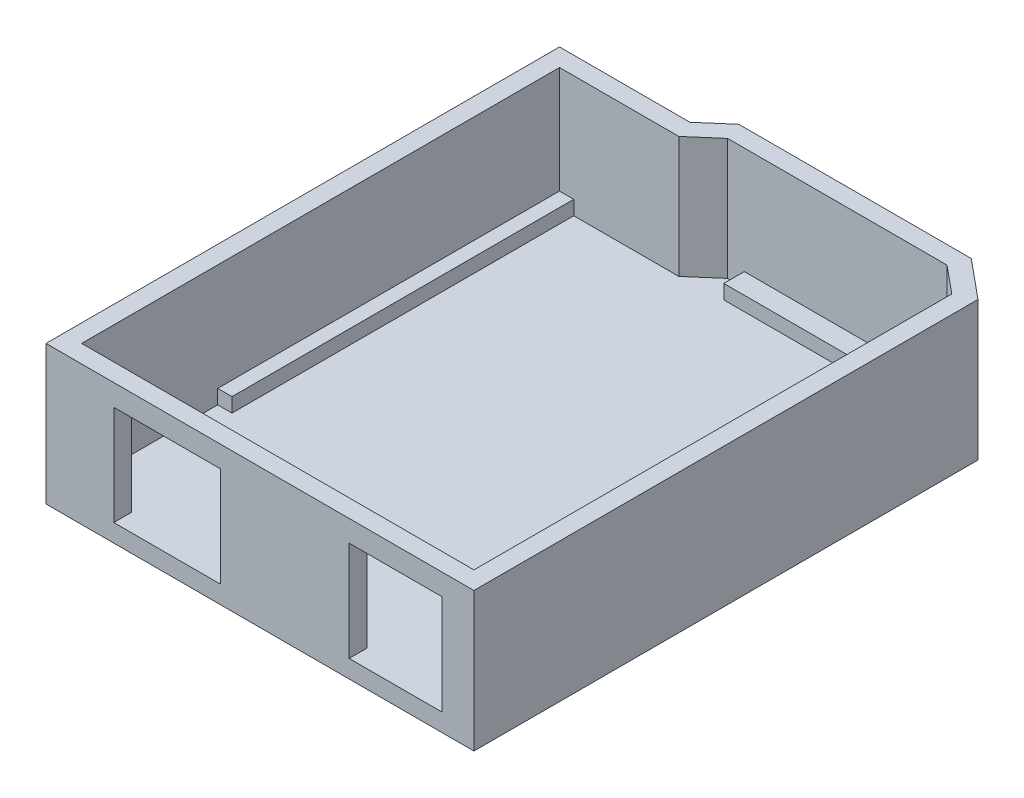
ISO-10303-21;
HEADER;
FILE_DESCRIPTION(('STEP AP214'),'2;1');
FILE_NAME('part.step','',(''),(''),'','','');
FILE_SCHEMA(('AUTOMOTIVE_DESIGN { 1 0 10303 214 1 1 1 1 }'));
ENDSEC;
DATA;
#1=APPLICATION_CONTEXT('core data for automotive mechanical design processes');
#2=APPLICATION_PROTOCOL_DEFINITION('international standard','automotive_design',2000,#1);
#3=PRODUCT_CONTEXT('',#1,'mechanical');
#4=PRODUCT('Part','Part','',(#3));
#5=PRODUCT_RELATED_PRODUCT_CATEGORY('part','',(#4));
#6=PRODUCT_DEFINITION_FORMATION('','',#4);
#7=PRODUCT_DEFINITION_CONTEXT('part definition',#1,'design');
#8=PRODUCT_DEFINITION('design','',#6,#7);
#9=PRODUCT_DEFINITION_SHAPE('','',#8);
#10=(LENGTH_UNIT() NAMED_UNIT(*) SI_UNIT(.MILLI.,.METRE.));
#11=(NAMED_UNIT(*) PLANE_ANGLE_UNIT() SI_UNIT($,.RADIAN.));
#12=(NAMED_UNIT(*) SI_UNIT($,.STERADIAN.) SOLID_ANGLE_UNIT());
#13=UNCERTAINTY_MEASURE_WITH_UNIT(LENGTH_MEASURE(1.E-05),#10,'distance_accuracy_value','');
#14=(GEOMETRIC_REPRESENTATION_CONTEXT(3) GLOBAL_UNCERTAINTY_ASSIGNED_CONTEXT((#13)) GLOBAL_UNIT_ASSIGNED_CONTEXT((#10,
#11,#12)) REPRESENTATION_CONTEXT('',''));
#15=CARTESIAN_POINT('',(0.,0.,0.));
#16=DIRECTION('',(0.,0.,1.));
#17=DIRECTION('',(1.,0.,0.));
#18=AXIS2_PLACEMENT_3D('',#15,#16,#17);
#19=CARTESIAN_POINT('',(0.,0.,0.));
#20=DIRECTION('',(0.,1.,0.));
#21=DIRECTION('',(0.,0.,1.));
#22=AXIS2_PLACEMENT_3D('',#19,#20,#21);
#23=PLANE('',#22);
#24=DIRECTION('',(1.,0.,0.));
#25=VECTOR('',#24,1.);
#26=CARTESIAN_POINT('',(22.7347806435726,0.,-67.3020667080368));
#27=LINE('',#26,#25);
#28=CARTESIAN_POINT('',(22.7347806435726,0.,-67.3020667080368));
#29=VERTEX_POINT('',#28);
#30=CARTESIAN_POINT('',(48.8818209057946,0.,-67.3020667080368));
#31=VERTEX_POINT('',#30);
#32=EDGE_CURVE('E746',#29,#31,#27,.T.);
#33=ORIENTED_EDGE('',*,*,#32,.F.);
#34=DIRECTION('',(0.,0.,1.));
#35=VECTOR('',#34,1.);
#36=CARTESIAN_POINT('',(22.7347806435726,0.,-67.3020667080368));
#37=LINE('',#36,#35);
#38=CARTESIAN_POINT('',(22.7347806435726,0.,-70.1768395355411));
#39=VERTEX_POINT('',#38);
#40=EDGE_CURVE('E268',#39,#29,#37,.T.);
#41=ORIENTED_EDGE('',*,*,#40,.F.);
#42=DIRECTION('',(-1.,0.,0.));
#43=VECTOR('',#42,1.);
#44=CARTESIAN_POINT('',(20.3927963137128,0.,-70.1768395355411));
#45=LINE('',#44,#43);
#46=CARTESIAN_POINT('',(20.3927963137128,0.,-70.1768395355411));
#47=VERTEX_POINT('',#46);
#48=EDGE_CURVE('E395',#39,#47,#45,.T.);
#49=ORIENTED_EDGE('',*,*,#48,.T.);
#50=DIRECTION('',(-0.75550682662175,0.,0.655140774893406));
#51=VECTOR('',#50,1.);
#52=CARTESIAN_POINT('',(16.7292723076339,0.,-67.));
#53=LINE('',#52,#51);
#54=CARTESIAN_POINT('',(16.7292723076339,0.,-67.));
#55=VERTEX_POINT('',#54);
#56=EDGE_CURVE('E399',#47,#55,#53,.T.);
#57=ORIENTED_EDGE('',*,*,#56,.T.);
#58=DIRECTION('',(-1.,0.,0.));
#59=VECTOR('',#58,1.);
#60=CARTESIAN_POINT('',(0.,0.,-67.));
#61=LINE('',#60,#59);
#62=CARTESIAN_POINT('',(2.,0.,-67.));
#63=VERTEX_POINT('',#62);
#64=EDGE_CURVE('E401',#55,#63,#61,.T.);
#65=ORIENTED_EDGE('',*,*,#64,.T.);
#66=DIRECTION('',(0.,0.,-1.));
#67=VECTOR('',#66,1.);
#68=CARTESIAN_POINT('',(2.,0.,-69.0781391182962));
#69=LINE('',#68,#67);
#70=CARTESIAN_POINT('',(2.00000000000001,0.,-19.0781391182962));
#71=VERTEX_POINT('',#70);
#72=EDGE_CURVE('E293',#71,#63,#69,.T.);
#73=ORIENTED_EDGE('',*,*,#72,.F.);
#74=DIRECTION('',(1.,0.,0.));
#75=VECTOR('',#74,1.);
#76=CARTESIAN_POINT('',(0.,0.,-19.0781391182962));
#77=LINE('',#76,#75);
#78=CARTESIAN_POINT('',(0.,0.,-19.0781391182962));
#79=VERTEX_POINT('',#78);
#80=EDGE_CURVE('E289',#79,#71,#77,.T.);
#81=ORIENTED_EDGE('',*,*,#80,.F.);
#82=DIRECTION('',(0.,0.,1.));
#83=VECTOR('',#82,1.);
#84=CARTESIAN_POINT('',(0.,0.,0.));
#85=LINE('',#84,#83);
#86=CARTESIAN_POINT('',(0.,0.,0.));
#87=VERTEX_POINT('',#86);
#88=EDGE_CURVE('E372',#79,#87,#85,.T.);
#89=ORIENTED_EDGE('',*,*,#88,.T.);
#90=DIRECTION('',(1.,0.,0.));
#91=VECTOR('',#90,1.);
#92=CARTESIAN_POINT('',(0.,0.,0.));
#93=LINE('',#92,#91);
#94=CARTESIAN_POINT('',(7.,0.,0.));
#95=VERTEX_POINT('',#94);
#96=EDGE_CURVE('E386',#87,#95,#93,.T.);
#97=ORIENTED_EDGE('',*,*,#96,.T.);
#98=DIRECTION('',(0.,0.,-1.));
#99=VECTOR('',#98,1.);
#100=CARTESIAN_POINT('',(7.,0.,4.));
#101=LINE('',#100,#99);
#102=CARTESIAN_POINT('',(7.,0.,2.5));
#103=VERTEX_POINT('',#102);
#104=EDGE_CURVE('E326',#103,#95,#101,.T.);
#105=ORIENTED_EDGE('',*,*,#104,.F.);
#106=DIRECTION('',(-1.,0.,0.));
#107=VECTOR('',#106,1.);
#108=CARTESIAN_POINT('',(0.,0.,2.5));
#109=LINE('',#108,#107);
#110=CARTESIAN_POINT('',(22.,0.,2.5));
#111=VERTEX_POINT('',#110);
#112=EDGE_CURVE('E356',#111,#103,#109,.T.);
#113=ORIENTED_EDGE('',*,*,#112,.F.);
#114=DIRECTION('',(0.,0.,-1.));
#115=VECTOR('',#114,1.);
#116=CARTESIAN_POINT('',(22.,0.,4.));
#117=LINE('',#116,#115);
#118=CARTESIAN_POINT('',(22.,0.,0.));
#119=VERTEX_POINT('',#118);
#120=EDGE_CURVE('E320',#111,#119,#117,.T.);
#121=ORIENTED_EDGE('',*,*,#120,.T.);
#122=CARTESIAN_POINT('',(40.,0.,0.));
#123=VERTEX_POINT('',#122);
#124=EDGE_CURVE('E390',#119,#123,#93,.T.);
#125=ORIENTED_EDGE('',*,*,#124,.T.);
#126=DIRECTION('',(0.,0.,-1.));
#127=VECTOR('',#126,1.);
#128=CARTESIAN_POINT('',(40.,0.,4.));
#129=LINE('',#128,#127);
#130=CARTESIAN_POINT('',(40.,0.,2.5));
#131=VERTEX_POINT('',#130);
#132=EDGE_CURVE('E314',#131,#123,#129,.T.);
#133=ORIENTED_EDGE('',*,*,#132,.F.);
#134=DIRECTION('',(-1.,0.,0.));
#135=VECTOR('',#134,1.);
#136=CARTESIAN_POINT('',(0.,0.,2.5));
#137=LINE('',#136,#135);
#138=CARTESIAN_POINT('',(53.,0.,2.5));
#139=VERTEX_POINT('',#138);
#140=EDGE_CURVE('E350',#139,#131,#137,.T.);
#141=ORIENTED_EDGE('',*,*,#140,.F.);
#142=DIRECTION('',(0.,0.,-1.));
#143=VECTOR('',#142,1.);
#144=CARTESIAN_POINT('',(53.,0.,4.));
#145=LINE('',#144,#143);
#146=CARTESIAN_POINT('',(53.,0.,0.));
#147=VERTEX_POINT('',#146);
#148=EDGE_CURVE('E339',#139,#147,#145,.T.);
#149=ORIENTED_EDGE('',*,*,#148,.T.);
#150=CARTESIAN_POINT('',(55.,0.,0.));
#151=VERTEX_POINT('',#150);
#152=EDGE_CURVE('E368',#147,#151,#93,.T.);
#153=ORIENTED_EDGE('',*,*,#152,.T.);
#154=DIRECTION('',(0.,0.,-1.));
#155=VECTOR('',#154,1.);
#156=CARTESIAN_POINT('',(55.,0.,0.));
#157=LINE('',#156,#155);
#158=CARTESIAN_POINT('',(55.,0.,-19.0781391182962));
#159=VERTEX_POINT('',#158);
#160=EDGE_CURVE('E389',#151,#159,#157,.T.);
#161=ORIENTED_EDGE('',*,*,#160,.T.);
#162=DIRECTION('',(1.,0.,0.));
#163=VECTOR('',#162,1.);
#164=CARTESIAN_POINT('',(55.,0.,-19.0781391182962));
#165=LINE('',#164,#163);
#166=CARTESIAN_POINT('',(53.,0.,-19.0781391182962));
#167=VERTEX_POINT('',#166);
#168=EDGE_CURVE('E272',#167,#159,#165,.T.);
#169=ORIENTED_EDGE('',*,*,#168,.F.);
#170=DIRECTION('',(0.,0.,1.));
#171=VECTOR('',#170,1.);
#172=CARTESIAN_POINT('',(53.,0.,-69.0781391182962));
#173=LINE('',#172,#171);
#174=CARTESIAN_POINT('',(53.,0.,-68.653660209048));
#175=VERTEX_POINT('',#174);
#176=EDGE_CURVE('E270',#175,#167,#173,.T.);
#177=ORIENTED_EDGE('',*,*,#176,.F.);
#178=DIRECTION('',(-0.770680459779966,0.,-0.637221805114468));
#179=VECTOR('',#178,1.);
#180=CARTESIAN_POINT('',(55.,0.,-67.));
#181=LINE('',#180,#179);
#182=CARTESIAN_POINT('',(51.1578085774102,0.,-70.1768395355411));
#183=VERTEX_POINT('',#182);
#184=EDGE_CURVE('E393',#175,#183,#181,.T.);
#185=ORIENTED_EDGE('',*,*,#184,.T.);
#186=CARTESIAN_POINT('',(48.8818209057946,0.,-70.1768395355411));
#187=VERTEX_POINT('',#186);
#188=EDGE_CURVE('E396',#183,#187,#45,.T.);
#189=ORIENTED_EDGE('',*,*,#188,.T.);
#190=DIRECTION('',(0.,0.,-1.));
#191=VECTOR('',#190,1.);
#192=CARTESIAN_POINT('',(48.8818209057946,0.,-67.3020667080368));
#193=LINE('',#192,#191);
#194=EDGE_CURVE('E264',#31,#187,#193,.T.);
#195=ORIENTED_EDGE('',*,*,#194,.F.);
#196=EDGE_LOOP('',(#33,#41,#49,#57,#65,#73,#81,#89,#97,#105,#113,#121,#125,#133,#141,#149,#153,
#161,#169,#177,#185,#189,#195));
#197=FACE_BOUND('',#196,.T.);
#198=ADVANCED_FACE('F37',(#197),#23,.T.);
#199=CARTESIAN_POINT('',(20.3927963137128,17.,-70.1768395355411));
#200=DIRECTION('',(0.,0.,1.));
#201=DIRECTION('',(1.,0.,0.));
#202=AXIS2_PLACEMENT_3D('',#199,#200,#201);
#203=PLANE('',#202);
#204=ORIENTED_EDGE('',*,*,#48,.F.);
#205=DIRECTION('',(0.,-1.,0.));
#206=VECTOR('',#205,1.);
#207=CARTESIAN_POINT('',(22.7347806435726,2.,-70.1768395355411));
#208=LINE('',#207,#206);
#209=CARTESIAN_POINT('',(22.7347806435726,2.,-70.1768395355411));
#210=VERTEX_POINT('',#209);
#211=EDGE_CURVE('E751',#210,#39,#208,.T.);
#212=ORIENTED_EDGE('',*,*,#211,.F.);
#213=DIRECTION('',(-1.,0.,0.));
#214=VECTOR('',#213,1.);
#215=CARTESIAN_POINT('',(22.7347806435726,2.,-70.1768395355411));
#216=LINE('',#215,#214);
#217=CARTESIAN_POINT('',(48.8818209057946,2.,-70.1768395355411));
#218=VERTEX_POINT('',#217);
#219=EDGE_CURVE('E261',#218,#210,#216,.T.);
#220=ORIENTED_EDGE('',*,*,#219,.F.);
#221=DIRECTION('',(0.,-1.,0.));
#222=VECTOR('',#221,1.);
#223=CARTESIAN_POINT('',(48.8818209057946,2.,-70.1768395355411));
#224=LINE('',#223,#222);
#225=EDGE_CURVE('E52',#218,#187,#224,.T.);
#226=ORIENTED_EDGE('',*,*,#225,.T.);
#227=ORIENTED_EDGE('',*,*,#188,.F.);
#228=DIRECTION('',(0.,-1.,0.));
#229=VECTOR('',#228,1.);
#230=CARTESIAN_POINT('',(51.1578085774102,17.,-70.1768395355411));
#231=LINE('',#230,#229);
#232=CARTESIAN_POINT('',(51.1578085774102,17.,-70.1768395355411));
#233=VERTEX_POINT('',#232);
#234=EDGE_CURVE('E416',#233,#183,#231,.T.);
#235=ORIENTED_EDGE('',*,*,#234,.F.);
#236=DIRECTION('',(-1.,0.,0.));
#237=VECTOR('',#236,1.);
#238=CARTESIAN_POINT('',(20.3927963137128,17.,-70.1768395355411));
#239=LINE('',#238,#237);
#240=CARTESIAN_POINT('',(20.3927963137128,17.,-70.1768395355411));
#241=VERTEX_POINT('',#240);
#242=EDGE_CURVE('E376',#233,#241,#239,.T.);
#243=ORIENTED_EDGE('',*,*,#242,.T.);
#244=DIRECTION('',(0.,-1.,0.));
#245=VECTOR('',#244,1.);
#246=CARTESIAN_POINT('',(20.3927963137128,17.,-70.1768395355411));
#247=LINE('',#246,#245);
#248=EDGE_CURVE('E413',#241,#47,#247,.T.);
#249=ORIENTED_EDGE('',*,*,#248,.T.);
#250=EDGE_LOOP('',(#204,#212,#220,#226,#227,#235,#243,#249));
#251=FACE_BOUND('',#250,.T.);
#252=ADVANCED_FACE('F497',(#251),#203,.T.);
#253=CARTESIAN_POINT('',(55.,17.,0.));
#254=DIRECTION('',(-1.,0.,0.));
#255=DIRECTION('',(0.,0.,1.));
#256=AXIS2_PLACEMENT_3D('',#253,#254,#255);
#257=PLANE('',#256);
#258=DIRECTION('',(0.,0.,-1.));
#259=VECTOR('',#258,1.);
#260=CARTESIAN_POINT('',(55.,2.,-69.0781391182962));
#261=LINE('',#260,#259);
#262=CARTESIAN_POINT('',(55.,2.,-19.0781391182962));
#263=VERTEX_POINT('',#262);
#264=CARTESIAN_POINT('',(55.,2.,-67.));
#265=VERTEX_POINT('',#264);
#266=EDGE_CURVE('E60',#263,#265,#261,.T.);
#267=ORIENTED_EDGE('',*,*,#266,.F.);
#268=DIRECTION('',(0.,-1.,0.));
#269=VECTOR('',#268,1.);
#270=CARTESIAN_POINT('',(55.,2.,-19.0781391182962));
#271=LINE('',#270,#269);
#272=EDGE_CURVE('E281',#263,#159,#271,.T.);
#273=ORIENTED_EDGE('',*,*,#272,.T.);
#274=ORIENTED_EDGE('',*,*,#160,.F.);
#275=DIRECTION('',(0.,-1.,0.));
#276=VECTOR('',#275,1.);
#277=CARTESIAN_POINT('',(55.,17.,0.));
#278=LINE('',#277,#276);
#279=CARTESIAN_POINT('',(55.,17.,0.));
#280=VERTEX_POINT('',#279);
#281=EDGE_CURVE('E422',#280,#151,#278,.T.);
#282=ORIENTED_EDGE('',*,*,#281,.F.);
#283=DIRECTION('',(0.,0.,-1.));
#284=VECTOR('',#283,1.);
#285=CARTESIAN_POINT('',(55.,17.,0.));
#286=LINE('',#285,#284);
#287=CARTESIAN_POINT('',(55.,17.,-67.));
#288=VERTEX_POINT('',#287);
#289=EDGE_CURVE('E371',#280,#288,#286,.T.);
#290=ORIENTED_EDGE('',*,*,#289,.T.);
#291=DIRECTION('',(0.,-1.,0.));
#292=VECTOR('',#291,1.);
#293=CARTESIAN_POINT('',(55.,17.,-67.));
#294=LINE('',#293,#292);
#295=EDGE_CURVE('E419',#288,#265,#294,.T.);
#296=ORIENTED_EDGE('',*,*,#295,.T.);
#297=EDGE_LOOP('',(#267,#273,#274,#282,#290,#296));
#298=FACE_BOUND('',#297,.T.);
#299=ADVANCED_FACE('F482',(#298),#257,.T.);
#300=CARTESIAN_POINT('',(55.,17.,-67.));
#301=DIRECTION('',(-0.637221805114468,0.,0.770680459779966));
#302=DIRECTION('',(0.770680459779966,0.,0.637221805114468));
#303=AXIS2_PLACEMENT_3D('',#300,#301,#302);
#304=PLANE('',#303);
#305=ORIENTED_EDGE('',*,*,#184,.F.);
#306=DIRECTION('',(0.,1.,0.));
#307=VECTOR('',#306,1.);
#308=CARTESIAN_POINT('',(53.,17.,-68.653660209048));
#309=LINE('',#308,#307);
#310=CARTESIAN_POINT('',(53.,2.,-68.653660209048));
#311=VERTEX_POINT('',#310);
#312=EDGE_CURVE('E11',#175,#311,#309,.T.);
#313=ORIENTED_EDGE('',*,*,#312,.T.);
#314=DIRECTION('',(0.770680459779966,0.,0.637221805114468));
#315=VECTOR('',#314,1.);
#316=CARTESIAN_POINT('',(55.,2.,-67.));
#317=LINE('',#316,#315);
#318=EDGE_CURVE('E45',#311,#265,#317,.T.);
#319=ORIENTED_EDGE('',*,*,#318,.T.);
#320=ORIENTED_EDGE('',*,*,#295,.F.);
#321=DIRECTION('',(-0.770680459779966,0.,-0.637221805114468));
#322=VECTOR('',#321,1.);
#323=CARTESIAN_POINT('',(55.,17.,-67.));
#324=LINE('',#323,#322);
#325=EDGE_CURVE('E374',#288,#233,#324,.T.);
#326=ORIENTED_EDGE('',*,*,#325,.T.);
#327=ORIENTED_EDGE('',*,*,#234,.T.);
#328=EDGE_LOOP('',(#305,#313,#319,#320,#326,#327));
#329=FACE_BOUND('',#328,.T.);
#330=ADVANCED_FACE('F478',(#329),#304,.T.);
#331=CARTESIAN_POINT('',(0.,17.,-67.));
#332=DIRECTION('',(0.,0.,1.));
#333=DIRECTION('',(1.,0.,0.));
#334=AXIS2_PLACEMENT_3D('',#331,#332,#333);
#335=PLANE('',#334);
#336=DIRECTION('',(-1.,0.,0.));
#337=VECTOR('',#336,1.);
#338=CARTESIAN_POINT('',(0.,2.,-67.));
#339=LINE('',#338,#337);
#340=CARTESIAN_POINT('',(2.,2.,-67.));
#341=VERTEX_POINT('',#340);
#342=CARTESIAN_POINT('',(0.,2.,-67.));
#343=VERTEX_POINT('',#342);
#344=EDGE_CURVE('E308',#341,#343,#339,.T.);
#345=ORIENTED_EDGE('',*,*,#344,.F.);
#346=DIRECTION('',(0.,-1.,0.));
#347=VECTOR('',#346,1.);
#348=CARTESIAN_POINT('',(2.,17.,-67.));
#349=LINE('',#348,#347);
#350=EDGE_CURVE('E305',#341,#63,#349,.T.);
#351=ORIENTED_EDGE('',*,*,#350,.T.);
#352=ORIENTED_EDGE('',*,*,#64,.F.);
#353=DIRECTION('',(0.,-1.,0.));
#354=VECTOR('',#353,1.);
#355=CARTESIAN_POINT('',(16.7292723076339,17.,-67.));
#356=LINE('',#355,#354);
#357=CARTESIAN_POINT('',(16.7292723076339,17.,-67.));
#358=VERTEX_POINT('',#357);
#359=EDGE_CURVE('E410',#358,#55,#356,.T.);
#360=ORIENTED_EDGE('',*,*,#359,.F.);
#361=DIRECTION('',(-1.,0.,0.));
#362=VECTOR('',#361,1.);
#363=CARTESIAN_POINT('',(0.,17.,-67.));
#364=LINE('',#363,#362);
#365=CARTESIAN_POINT('',(0.,17.,-67.));
#366=VERTEX_POINT('',#365);
#367=EDGE_CURVE('E380',#358,#366,#364,.T.);
#368=ORIENTED_EDGE('',*,*,#367,.T.);
#369=DIRECTION('',(0.,-1.,0.));
#370=VECTOR('',#369,1.);
#371=CARTESIAN_POINT('',(0.,17.,-67.));
#372=LINE('',#371,#370);
#373=EDGE_CURVE('E407',#366,#343,#372,.T.);
#374=ORIENTED_EDGE('',*,*,#373,.T.);
#375=EDGE_LOOP('',(#345,#351,#352,#360,#368,#374));
#376=FACE_BOUND('',#375,.T.);
#377=ADVANCED_FACE('F533',(#376),#335,.T.);
#378=CARTESIAN_POINT('',(0.,17.,0.));
#379=DIRECTION('',(1.,0.,0.));
#380=DIRECTION('',(0.,0.,-1.));
#381=AXIS2_PLACEMENT_3D('',#378,#379,#380);
#382=PLANE('',#381);
#383=ORIENTED_EDGE('',*,*,#88,.F.);
#384=DIRECTION('',(0.,-1.,0.));
#385=VECTOR('',#384,1.);
#386=CARTESIAN_POINT('',(0.,2.,-19.0781391182962));
#387=LINE('',#386,#385);
#388=CARTESIAN_POINT('',(0.,2.,-19.0781391182962));
#389=VERTEX_POINT('',#388);
#390=EDGE_CURVE('E303',#389,#79,#387,.T.);
#391=ORIENTED_EDGE('',*,*,#390,.F.);
#392=DIRECTION('',(0.,0.,1.));
#393=VECTOR('',#392,1.);
#394=CARTESIAN_POINT('',(0.,2.,-69.0781391182962));
#395=LINE('',#394,#393);
#396=EDGE_CURVE('E290',#343,#389,#395,.T.);
#397=ORIENTED_EDGE('',*,*,#396,.F.);
#398=ORIENTED_EDGE('',*,*,#373,.F.);
#399=DIRECTION('',(0.,0.,1.));
#400=VECTOR('',#399,1.);
#401=CARTESIAN_POINT('',(0.,17.,0.));
#402=LINE('',#401,#400);
#403=CARTESIAN_POINT('',(0.,17.,0.));
#404=VERTEX_POINT('',#403);
#405=EDGE_CURVE('E383',#366,#404,#402,.T.);
#406=ORIENTED_EDGE('',*,*,#405,.T.);
#407=DIRECTION('',(0.,-1.,0.));
#408=VECTOR('',#407,1.);
#409=CARTESIAN_POINT('',(0.,17.,0.));
#410=LINE('',#409,#408);
#411=EDGE_CURVE('E385',#404,#87,#410,.T.);
#412=ORIENTED_EDGE('',*,*,#411,.T.);
#413=EDGE_LOOP('',(#383,#391,#397,#398,#406,#412));
#414=FACE_BOUND('',#413,.T.);
#415=ADVANCED_FACE('F529',(#414),#382,.T.);
#416=CARTESIAN_POINT('',(0.,17.,2.5));
#417=DIRECTION('',(0.,0.,-1.));
#418=DIRECTION('',(-1.,0.,0.));
#419=AXIS2_PLACEMENT_3D('',#416,#417,#418);
#420=PLANE('',#419);
#421=DIRECTION('',(1.,0.,0.));
#422=VECTOR('',#421,1.);
#423=CARTESIAN_POINT('',(0.,14.,2.5));
#424=LINE('',#423,#422);
#425=CARTESIAN_POINT('',(7.,14.,2.5));
#426=VERTEX_POINT('',#425);
#427=CARTESIAN_POINT('',(22.,14.,2.5));
#428=VERTEX_POINT('',#427);
#429=EDGE_CURVE('E362',#426,#428,#424,.T.);
#430=ORIENTED_EDGE('',*,*,#429,.T.);
#431=DIRECTION('',(0.,-1.,0.));
#432=VECTOR('',#431,1.);
#433=CARTESIAN_POINT('',(22.,17.,2.5));
#434=LINE('',#433,#432);
#435=EDGE_CURVE('E365',#428,#111,#434,.T.);
#436=ORIENTED_EDGE('',*,*,#435,.T.);
#437=ORIENTED_EDGE('',*,*,#112,.T.);
#438=DIRECTION('',(0.,1.,0.));
#439=VECTOR('',#438,1.);
#440=CARTESIAN_POINT('',(7.,17.,2.5));
#441=LINE('',#440,#439);
#442=EDGE_CURVE('E359',#103,#426,#441,.T.);
#443=ORIENTED_EDGE('',*,*,#442,.T.);
#444=EDGE_LOOP('',(#430,#436,#437,#443));
#445=FACE_BOUND('',#444,.T.);
#446=ORIENTED_EDGE('',*,*,#140,.T.);
#447=DIRECTION('',(0.,1.,0.));
#448=VECTOR('',#447,1.);
#449=CARTESIAN_POINT('',(40.,17.,2.5));
#450=LINE('',#449,#448);
#451=CARTESIAN_POINT('',(40.,14.,2.5));
#452=VERTEX_POINT('',#451);
#453=EDGE_CURVE('E353',#131,#452,#450,.T.);
#454=ORIENTED_EDGE('',*,*,#453,.T.);
#455=DIRECTION('',(1.,0.,0.));
#456=VECTOR('',#455,1.);
#457=CARTESIAN_POINT('',(0.,14.,2.5));
#458=LINE('',#457,#456);
#459=CARTESIAN_POINT('',(53.,14.,2.5));
#460=VERTEX_POINT('',#459);
#461=EDGE_CURVE('E323',#452,#460,#458,.T.);
#462=ORIENTED_EDGE('',*,*,#461,.T.);
#463=DIRECTION('',(0.,-1.,0.));
#464=VECTOR('',#463,1.);
#465=CARTESIAN_POINT('',(53.,17.,2.5));
#466=LINE('',#465,#464);
#467=EDGE_CURVE('E347',#460,#139,#466,.T.);
#468=ORIENTED_EDGE('',*,*,#467,.T.);
#469=EDGE_LOOP('',(#446,#454,#462,#468));
#470=FACE_BOUND('',#469,.T.);
#471=DIRECTION('',(1.,0.,0.));
#472=VECTOR('',#471,1.);
#473=CARTESIAN_POINT('',(0.,-2.5,2.5));
#474=LINE('',#473,#472);
#475=CARTESIAN_POINT('',(-2.5,-2.5,2.5));
#476=VERTEX_POINT('',#475);
#477=CARTESIAN_POINT('',(57.5,-2.5,2.5));
#478=VERTEX_POINT('',#477);
#479=EDGE_CURVE('E425',#476,#478,#474,.T.);
#480=ORIENTED_EDGE('',*,*,#479,.T.);
#481=DIRECTION('',(0.,-1.,0.));
#482=VECTOR('',#481,1.);
#483=CARTESIAN_POINT('',(57.5,17.,2.5));
#484=LINE('',#483,#482);
#485=CARTESIAN_POINT('',(57.5,17.,2.5));
#486=VERTEX_POINT('',#485);
#487=EDGE_CURVE('E429',#486,#478,#484,.T.);
#488=ORIENTED_EDGE('',*,*,#487,.F.);
#489=DIRECTION('',(1.,0.,0.));
#490=VECTOR('',#489,1.);
#491=CARTESIAN_POINT('',(0.,17.,2.5));
#492=LINE('',#491,#490);
#493=CARTESIAN_POINT('',(-2.5,17.,2.5));
#494=VERTEX_POINT('',#493);
#495=EDGE_CURVE('E462',#494,#486,#492,.T.);
#496=ORIENTED_EDGE('',*,*,#495,.F.);
#497=DIRECTION('',(0.,-1.,0.));
#498=VECTOR('',#497,1.);
#499=CARTESIAN_POINT('',(-2.5,17.,2.5));
#500=LINE('',#499,#498);
#501=EDGE_CURVE('E433',#494,#476,#500,.T.);
#502=ORIENTED_EDGE('',*,*,#501,.T.);
#503=EDGE_LOOP('',(#480,#488,#496,#502));
#504=FACE_BOUND('',#503,.T.);
#505=ADVANCED_FACE('F532',(#445,#470,#504),#420,.F.);
#506=CARTESIAN_POINT('',(57.5,17.,0.));
#507=DIRECTION('',(-1.,0.,0.));
#508=DIRECTION('',(0.,0.,1.));
#509=AXIS2_PLACEMENT_3D('',#506,#507,#508);
#510=PLANE('',#509);
#511=DIRECTION('',(0.,0.,-1.));
#512=VECTOR('',#511,1.);
#513=CARTESIAN_POINT('',(57.5,-2.5,0.));
#514=LINE('',#513,#512);
#515=CARTESIAN_POINT('',(57.5,-2.5,-68.1768113174593));
#516=VERTEX_POINT('',#515);
#517=EDGE_CURVE('E428',#478,#516,#514,.T.);
#518=ORIENTED_EDGE('',*,*,#517,.T.);
#519=DIRECTION('',(0.,-1.,0.));
#520=VECTOR('',#519,1.);
#521=CARTESIAN_POINT('',(57.5,17.,-68.1768113174593));
#522=LINE('',#521,#520);
#523=CARTESIAN_POINT('',(57.5,17.,-68.1768113174593));
#524=VERTEX_POINT('',#523);
#525=EDGE_CURVE('E432',#524,#516,#522,.T.);
#526=ORIENTED_EDGE('',*,*,#525,.F.);
#527=DIRECTION('',(0.,0.,-1.));
#528=VECTOR('',#527,1.);
#529=CARTESIAN_POINT('',(57.5,17.,0.));
#530=LINE('',#529,#528);
#531=EDGE_CURVE('E465',#486,#524,#530,.T.);
#532=ORIENTED_EDGE('',*,*,#531,.F.);
#533=ORIENTED_EDGE('',*,*,#487,.T.);
#534=EDGE_LOOP('',(#518,#526,#532,#533));
#535=FACE_BOUND('',#534,.T.);
#536=ADVANCED_FACE('F555',(#535),#510,.F.);
#537=CARTESIAN_POINT('',(56.5930545127862,17.,-68.9267011494499));
#538=DIRECTION('',(-0.637221805114468,0.,0.770680459779966));
#539=DIRECTION('',(0.770680459779966,0.,0.637221805114468));
#540=AXIS2_PLACEMENT_3D('',#537,#538,#539);
#541=PLANE('',#540);
#542=DIRECTION('',(-0.770680459779966,0.,-0.637221805114468));
#543=VECTOR('',#542,1.);
#544=CARTESIAN_POINT('',(56.5930545127862,-2.5,-68.9267011494499));
#545=LINE('',#544,#543);
#546=CARTESIAN_POINT('',(52.0574935002247,-2.5,-72.6768395355411));
#547=VERTEX_POINT('',#546);
#548=EDGE_CURVE('E439',#516,#547,#545,.T.);
#549=ORIENTED_EDGE('',*,*,#548,.T.);
#550=DIRECTION('',(0.,-1.,0.));
#551=VECTOR('',#550,1.);
#552=CARTESIAN_POINT('',(52.0574935002247,17.,-72.6768395355411));
#553=LINE('',#552,#551);
#554=CARTESIAN_POINT('',(52.0574935002247,17.,-72.6768395355411));
#555=VERTEX_POINT('',#554);
#556=EDGE_CURVE('E442',#555,#547,#553,.T.);
#557=ORIENTED_EDGE('',*,*,#556,.F.);
#558=DIRECTION('',(-0.770680459779966,0.,-0.637221805114468));
#559=VECTOR('',#558,1.);
#560=CARTESIAN_POINT('',(56.5930545127862,17.,-68.9267011494499));
#561=LINE('',#560,#559);
#562=EDGE_CURVE('E467',#524,#555,#561,.T.);
#563=ORIENTED_EDGE('',*,*,#562,.F.);
#564=ORIENTED_EDGE('',*,*,#525,.T.);
#565=EDGE_LOOP('',(#549,#557,#563,#564));
#566=FACE_BOUND('',#565,.T.);
#567=ADVANCED_FACE('F559',(#566),#541,.F.);
#568=CARTESIAN_POINT('',(20.3927963137128,17.,-72.6768395355411));
#569=DIRECTION('',(0.,0.,1.));
#570=DIRECTION('',(1.,0.,0.));
#571=AXIS2_PLACEMENT_3D('',#568,#569,#570);
#572=PLANE('',#571);
#573=DIRECTION('',(-1.,0.,0.));
#574=VECTOR('',#573,1.);
#575=CARTESIAN_POINT('',(20.3927963137128,-2.5,-72.6768395355411));
#576=LINE('',#575,#574);
#577=CARTESIAN_POINT('',(19.4598167818785,-2.5,-72.6768395355411));
#578=VERTEX_POINT('',#577);
#579=EDGE_CURVE('E444',#547,#578,#576,.T.);
#580=ORIENTED_EDGE('',*,*,#579,.T.);
#581=DIRECTION('',(0.,-1.,0.));
#582=VECTOR('',#581,1.);
#583=CARTESIAN_POINT('',(19.4598167818785,17.,-72.6768395355411));
#584=LINE('',#583,#582);
#585=CARTESIAN_POINT('',(19.4598167818785,17.,-72.6768395355411));
#586=VERTEX_POINT('',#585);
#587=EDGE_CURVE('E447',#586,#578,#584,.T.);
#588=ORIENTED_EDGE('',*,*,#587,.F.);
#589=DIRECTION('',(-1.,0.,0.));
#590=VECTOR('',#589,1.);
#591=CARTESIAN_POINT('',(20.3927963137128,17.,-72.6768395355411));
#592=LINE('',#591,#590);
#593=EDGE_CURVE('E469',#555,#586,#592,.T.);
#594=ORIENTED_EDGE('',*,*,#593,.F.);
#595=ORIENTED_EDGE('',*,*,#556,.T.);
#596=EDGE_LOOP('',(#580,#588,#594,#595));
#597=FACE_BOUND('',#596,.T.);
#598=ADVANCED_FACE('F563',(#597),#572,.F.);
#599=CARTESIAN_POINT('',(15.0914203704004,17.,-68.8887670665544));
#600=DIRECTION('',(0.655140774893406,0.,0.75550682662175));
#601=DIRECTION('',(0.75550682662175,0.,-0.655140774893406));
#602=AXIS2_PLACEMENT_3D('',#599,#600,#601);
#603=PLANE('',#602);
#604=DIRECTION('',(-0.75550682662175,0.,0.655140774893406));
#605=VECTOR('',#604,1.);
#606=CARTESIAN_POINT('',(15.0914203704004,-2.5,-68.8887670665544));
#607=LINE('',#606,#605);
#608=CARTESIAN_POINT('',(15.7962927757996,-2.5,-69.5));
#609=VERTEX_POINT('',#608);
#610=EDGE_CURVE('E449',#578,#609,#607,.T.);
#611=ORIENTED_EDGE('',*,*,#610,.T.);
#612=DIRECTION('',(0.,-1.,0.));
#613=VECTOR('',#612,1.);
#614=CARTESIAN_POINT('',(15.7962927757996,17.,-69.5));
#615=LINE('',#614,#613);
#616=CARTESIAN_POINT('',(15.7962927757996,17.,-69.5));
#617=VERTEX_POINT('',#616);
#618=EDGE_CURVE('E452',#617,#609,#615,.T.);
#619=ORIENTED_EDGE('',*,*,#618,.F.);
#620=DIRECTION('',(-0.75550682662175,0.,0.655140774893406));
#621=VECTOR('',#620,1.);
#622=CARTESIAN_POINT('',(15.0914203704004,17.,-68.8887670665544));
#623=LINE('',#622,#621);
#624=EDGE_CURVE('E471',#586,#617,#623,.T.);
#625=ORIENTED_EDGE('',*,*,#624,.F.);
#626=ORIENTED_EDGE('',*,*,#587,.T.);
#627=EDGE_LOOP('',(#611,#619,#625,#626));
#628=FACE_BOUND('',#627,.T.);
#629=ADVANCED_FACE('F567',(#628),#603,.F.);
#630=CARTESIAN_POINT('',(0.,17.,-69.5));
#631=DIRECTION('',(0.,0.,1.));
#632=DIRECTION('',(1.,0.,0.));
#633=AXIS2_PLACEMENT_3D('',#630,#631,#632);
#634=PLANE('',#633);
#635=DIRECTION('',(-1.,0.,0.));
#636=VECTOR('',#635,1.);
#637=CARTESIAN_POINT('',(0.,-2.5,-69.5));
#638=LINE('',#637,#636);
#639=CARTESIAN_POINT('',(-2.5,-2.5,-69.5));
#640=VERTEX_POINT('',#639);
#641=EDGE_CURVE('E454',#609,#640,#638,.T.);
#642=ORIENTED_EDGE('',*,*,#641,.T.);
#643=DIRECTION('',(0.,-1.,0.));
#644=VECTOR('',#643,1.);
#645=CARTESIAN_POINT('',(-2.5,17.,-69.5));
#646=LINE('',#645,#644);
#647=CARTESIAN_POINT('',(-2.5,17.,-69.5));
#648=VERTEX_POINT('',#647);
#649=EDGE_CURVE('E436',#648,#640,#646,.T.);
#650=ORIENTED_EDGE('',*,*,#649,.F.);
#651=DIRECTION('',(-1.,0.,0.));
#652=VECTOR('',#651,1.);
#653=CARTESIAN_POINT('',(0.,17.,-69.5));
#654=LINE('',#653,#652);
#655=EDGE_CURVE('E473',#617,#648,#654,.T.);
#656=ORIENTED_EDGE('',*,*,#655,.F.);
#657=ORIENTED_EDGE('',*,*,#618,.T.);
#658=EDGE_LOOP('',(#642,#650,#656,#657));
#659=FACE_BOUND('',#658,.T.);
#660=ADVANCED_FACE('F571',(#659),#634,.F.);
#661=CARTESIAN_POINT('',(-2.5,17.,0.));
#662=DIRECTION('',(1.,0.,0.));
#663=DIRECTION('',(0.,0.,-1.));
#664=AXIS2_PLACEMENT_3D('',#661,#662,#663);
#665=PLANE('',#664);
#666=DIRECTION('',(0.,0.,1.));
#667=VECTOR('',#666,1.);
#668=CARTESIAN_POINT('',(-2.5,-2.5,0.));
#669=LINE('',#668,#667);
#670=EDGE_CURVE('E458',#640,#476,#669,.T.);
#671=ORIENTED_EDGE('',*,*,#670,.T.);
#672=ORIENTED_EDGE('',*,*,#501,.F.);
#673=DIRECTION('',(0.,0.,1.));
#674=VECTOR('',#673,1.);
#675=CARTESIAN_POINT('',(-2.5,17.,0.));
#676=LINE('',#675,#674);
#677=EDGE_CURVE('E437',#648,#494,#676,.T.);
#678=ORIENTED_EDGE('',*,*,#677,.F.);
#679=ORIENTED_EDGE('',*,*,#649,.T.);
#680=EDGE_LOOP('',(#671,#672,#678,#679));
#681=FACE_BOUND('',#680,.T.);
#682=ADVANCED_FACE('F552',(#681),#665,.F.);
#683=CARTESIAN_POINT('',(0.,17.,0.));
#684=DIRECTION('',(0.,1.,0.));
#685=DIRECTION('',(0.,0.,1.));
#686=AXIS2_PLACEMENT_3D('',#683,#684,#685);
#687=PLANE('',#686);
#688=DIRECTION('',(1.,0.,0.));
#689=VECTOR('',#688,1.);
#690=CARTESIAN_POINT('',(0.,17.,0.));
#691=LINE('',#690,#689);
#692=EDGE_CURVE('E369',#404,#280,#691,.T.);
#693=ORIENTED_EDGE('',*,*,#692,.F.);
#694=ORIENTED_EDGE('',*,*,#405,.F.);
#695=ORIENTED_EDGE('',*,*,#367,.F.);
#696=DIRECTION('',(-0.75550682662175,0.,0.655140774893406));
#697=VECTOR('',#696,1.);
#698=CARTESIAN_POINT('',(16.7292723076339,17.,-67.));
#699=LINE('',#698,#697);
#700=EDGE_CURVE('E378',#241,#358,#699,.T.);
#701=ORIENTED_EDGE('',*,*,#700,.F.);
#702=ORIENTED_EDGE('',*,*,#242,.F.);
#703=ORIENTED_EDGE('',*,*,#325,.F.);
#704=ORIENTED_EDGE('',*,*,#289,.F.);
#705=EDGE_LOOP('',(#693,#694,#695,#701,#702,#703,#704));
#706=FACE_BOUND('',#705,.T.);
#707=ORIENTED_EDGE('',*,*,#495,.T.);
#708=ORIENTED_EDGE('',*,*,#531,.T.);
#709=ORIENTED_EDGE('',*,*,#562,.T.);
#710=ORIENTED_EDGE('',*,*,#593,.T.);
#711=ORIENTED_EDGE('',*,*,#624,.T.);
#712=ORIENTED_EDGE('',*,*,#655,.T.);
#713=ORIENTED_EDGE('',*,*,#677,.T.);
#714=EDGE_LOOP('',(#707,#708,#709,#710,#711,#712,#713));
#715=FACE_BOUND('',#714,.T.);
#716=ADVANCED_FACE('F488',(#706,#715),#687,.T.);
#717=CARTESIAN_POINT('',(0.,-2.5,0.));
#718=DIRECTION('',(0.,1.,0.));
#719=DIRECTION('',(0.,0.,1.));
#720=AXIS2_PLACEMENT_3D('',#717,#718,#719);
#721=PLANE('',#720);
#722=ORIENTED_EDGE('',*,*,#479,.F.);
#723=ORIENTED_EDGE('',*,*,#670,.F.);
#724=ORIENTED_EDGE('',*,*,#641,.F.);
#725=ORIENTED_EDGE('',*,*,#610,.F.);
#726=ORIENTED_EDGE('',*,*,#579,.F.);
#727=ORIENTED_EDGE('',*,*,#548,.F.);
#728=ORIENTED_EDGE('',*,*,#517,.F.);
#729=EDGE_LOOP('',(#722,#723,#724,#725,#726,#727,#728));
#730=FACE_BOUND('',#729,.T.);
#731=ADVANCED_FACE('F39',(#730),#721,.F.);
#732=CARTESIAN_POINT('',(0.,17.,0.));
#733=DIRECTION('',(0.,0.,-1.));
#734=DIRECTION('',(-1.,0.,0.));
#735=AXIS2_PLACEMENT_3D('',#732,#733,#734);
#736=PLANE('',#735);
#737=DIRECTION('',(0.,-1.,0.));
#738=VECTOR('',#737,1.);
#739=CARTESIAN_POINT('',(22.,14.,0.));
#740=LINE('',#739,#738);
#741=CARTESIAN_POINT('',(22.,14.,0.));
#742=VERTEX_POINT('',#741);
#743=EDGE_CURVE('E311',#742,#119,#740,.T.);
#744=ORIENTED_EDGE('',*,*,#743,.F.);
#745=DIRECTION('',(1.,0.,0.));
#746=VECTOR('',#745,1.);
#747=CARTESIAN_POINT('',(22.,14.,0.));
#748=LINE('',#747,#746);
#749=CARTESIAN_POINT('',(7.,14.,0.));
#750=VERTEX_POINT('',#749);
#751=EDGE_CURVE('E317',#750,#742,#748,.T.);
#752=ORIENTED_EDGE('',*,*,#751,.F.);
#753=DIRECTION('',(0.,1.,0.));
#754=VECTOR('',#753,1.);
#755=CARTESIAN_POINT('',(7.,14.,0.));
#756=LINE('',#755,#754);
#757=EDGE_CURVE('E313',#95,#750,#756,.T.);
#758=ORIENTED_EDGE('',*,*,#757,.F.);
#759=ORIENTED_EDGE('',*,*,#96,.F.);
#760=ORIENTED_EDGE('',*,*,#411,.F.);
#761=ORIENTED_EDGE('',*,*,#692,.T.);
#762=ORIENTED_EDGE('',*,*,#281,.T.);
#763=ORIENTED_EDGE('',*,*,#152,.F.);
#764=DIRECTION('',(0.,-1.,0.));
#765=VECTOR('',#764,1.);
#766=CARTESIAN_POINT('',(53.,14.,0.));
#767=LINE('',#766,#765);
#768=CARTESIAN_POINT('',(53.,14.,0.));
#769=VERTEX_POINT('',#768);
#770=EDGE_CURVE('E335',#769,#147,#767,.T.);
#771=ORIENTED_EDGE('',*,*,#770,.F.);
#772=DIRECTION('',(1.,0.,0.));
#773=VECTOR('',#772,1.);
#774=CARTESIAN_POINT('',(40.,14.,0.));
#775=LINE('',#774,#773);
#776=CARTESIAN_POINT('',(40.,14.,0.));
#777=VERTEX_POINT('',#776);
#778=EDGE_CURVE('E332',#777,#769,#775,.T.);
#779=ORIENTED_EDGE('',*,*,#778,.F.);
#780=DIRECTION('',(0.,1.,0.));
#781=VECTOR('',#780,1.);
#782=CARTESIAN_POINT('',(40.,14.,0.));
#783=LINE('',#782,#781);
#784=EDGE_CURVE('E310',#123,#777,#783,.T.);
#785=ORIENTED_EDGE('',*,*,#784,.F.);
#786=ORIENTED_EDGE('',*,*,#124,.F.);
#787=EDGE_LOOP('',(#744,#752,#758,#759,#760,#761,#762,#763,#771,#779,#785,#786));
#788=FACE_BOUND('',#787,.T.);
#789=ADVANCED_FACE('F540',(#788),#736,.T.);
#790=CARTESIAN_POINT('',(16.7292723076339,17.,-67.));
#791=DIRECTION('',(0.655140774893406,0.,0.75550682662175));
#792=DIRECTION('',(0.75550682662175,0.,-0.655140774893406));
#793=AXIS2_PLACEMENT_3D('',#790,#791,#792);
#794=PLANE('',#793);
#795=ORIENTED_EDGE('',*,*,#56,.F.);
#796=ORIENTED_EDGE('',*,*,#248,.F.);
#797=ORIENTED_EDGE('',*,*,#700,.T.);
#798=ORIENTED_EDGE('',*,*,#359,.T.);
#799=EDGE_LOOP('',(#795,#796,#797,#798));
#800=FACE_BOUND('',#799,.T.);
#801=ADVANCED_FACE('F538',(#800),#794,.T.);
#802=CARTESIAN_POINT('',(40.,14.,4.));
#803=DIRECTION('',(-1.,0.,0.));
#804=DIRECTION('',(0.,0.,1.));
#805=AXIS2_PLACEMENT_3D('',#802,#803,#804);
#806=PLANE('',#805);
#807=ORIENTED_EDGE('',*,*,#132,.T.);
#808=ORIENTED_EDGE('',*,*,#784,.T.);
#809=DIRECTION('',(0.,0.,-1.));
#810=VECTOR('',#809,1.);
#811=CARTESIAN_POINT('',(40.,14.,4.));
#812=LINE('',#811,#810);
#813=EDGE_CURVE('E337',#452,#777,#812,.T.);
#814=ORIENTED_EDGE('',*,*,#813,.F.);
#815=ORIENTED_EDGE('',*,*,#453,.F.);
#816=EDGE_LOOP('',(#807,#808,#814,#815));
#817=FACE_BOUND('',#816,.T.);
#818=ADVANCED_FACE('F527',(#817),#806,.F.);
#819=CARTESIAN_POINT('',(53.,14.,4.));
#820=DIRECTION('',(1.,0.,0.));
#821=DIRECTION('',(0.,0.,-1.));
#822=AXIS2_PLACEMENT_3D('',#819,#820,#821);
#823=PLANE('',#822);
#824=DIRECTION('',(0.,0.,-1.));
#825=VECTOR('',#824,1.);
#826=CARTESIAN_POINT('',(53.,14.,4.));
#827=LINE('',#826,#825);
#828=EDGE_CURVE('E342',#460,#769,#827,.T.);
#829=ORIENTED_EDGE('',*,*,#828,.T.);
#830=ORIENTED_EDGE('',*,*,#770,.T.);
#831=ORIENTED_EDGE('',*,*,#148,.F.);
#832=ORIENTED_EDGE('',*,*,#467,.F.);
#833=EDGE_LOOP('',(#829,#830,#831,#832));
#834=FACE_BOUND('',#833,.T.);
#835=ADVANCED_FACE('F620',(#834),#823,.F.);
#836=CARTESIAN_POINT('',(40.,14.,4.));
#837=DIRECTION('',(0.,1.,0.));
#838=DIRECTION('',(-1.,0.,0.));
#839=AXIS2_PLACEMENT_3D('',#836,#837,#838);
#840=PLANE('',#839);
#841=ORIENTED_EDGE('',*,*,#813,.T.);
#842=ORIENTED_EDGE('',*,*,#778,.T.);
#843=ORIENTED_EDGE('',*,*,#828,.F.);
#844=ORIENTED_EDGE('',*,*,#461,.F.);
#845=EDGE_LOOP('',(#841,#842,#843,#844));
#846=FACE_BOUND('',#845,.T.);
#847=ADVANCED_FACE('F627',(#846),#840,.F.);
#848=CARTESIAN_POINT('',(22.,14.,4.));
#849=DIRECTION('',(1.,0.,0.));
#850=DIRECTION('',(0.,1.,0.));
#851=AXIS2_PLACEMENT_3D('',#848,#849,#850);
#852=PLANE('',#851);
#853=DIRECTION('',(0.,0.,-1.));
#854=VECTOR('',#853,1.);
#855=CARTESIAN_POINT('',(22.,14.,4.));
#856=LINE('',#855,#854);
#857=EDGE_CURVE('E321',#428,#742,#856,.T.);
#858=ORIENTED_EDGE('',*,*,#857,.T.);
#859=ORIENTED_EDGE('',*,*,#743,.T.);
#860=ORIENTED_EDGE('',*,*,#120,.F.);
#861=ORIENTED_EDGE('',*,*,#435,.F.);
#862=EDGE_LOOP('',(#858,#859,#860,#861));
#863=FACE_BOUND('',#862,.T.);
#864=ADVANCED_FACE('F635',(#863),#852,.F.);
#865=CARTESIAN_POINT('',(22.,14.,4.));
#866=DIRECTION('',(0.,1.,0.));
#867=DIRECTION('',(-1.,0.,0.));
#868=AXIS2_PLACEMENT_3D('',#865,#866,#867);
#869=PLANE('',#868);
#870=DIRECTION('',(0.,0.,-1.));
#871=VECTOR('',#870,1.);
#872=CARTESIAN_POINT('',(7.,14.,4.));
#873=LINE('',#872,#871);
#874=EDGE_CURVE('E324',#426,#750,#873,.T.);
#875=ORIENTED_EDGE('',*,*,#874,.T.);
#876=ORIENTED_EDGE('',*,*,#751,.T.);
#877=ORIENTED_EDGE('',*,*,#857,.F.);
#878=ORIENTED_EDGE('',*,*,#429,.F.);
#879=EDGE_LOOP('',(#875,#876,#877,#878));
#880=FACE_BOUND('',#879,.T.);
#881=ADVANCED_FACE('F642',(#880),#869,.F.);
#882=CARTESIAN_POINT('',(7.,14.,4.));
#883=DIRECTION('',(-1.,0.,0.));
#884=DIRECTION('',(0.,-1.,0.));
#885=AXIS2_PLACEMENT_3D('',#882,#883,#884);
#886=PLANE('',#885);
#887=ORIENTED_EDGE('',*,*,#104,.T.);
#888=ORIENTED_EDGE('',*,*,#757,.T.);
#889=ORIENTED_EDGE('',*,*,#874,.F.);
#890=ORIENTED_EDGE('',*,*,#442,.F.);
#891=EDGE_LOOP('',(#887,#888,#889,#890));
#892=FACE_BOUND('',#891,.T.);
#893=ADVANCED_FACE('F650',(#892),#886,.F.);
#894=CARTESIAN_POINT('',(0.,2.,-19.0781391182962));
#895=DIRECTION('',(0.,0.,-1.));
#896=DIRECTION('',(-1.,0.,0.));
#897=AXIS2_PLACEMENT_3D('',#894,#895,#896);
#898=PLANE('',#897);
#899=ORIENTED_EDGE('',*,*,#80,.T.);
#900=DIRECTION('',(0.,-1.,0.));
#901=VECTOR('',#900,1.);
#902=CARTESIAN_POINT('',(2.00000000000001,2.,-19.0781391182962));
#903=LINE('',#902,#901);
#904=CARTESIAN_POINT('',(2.00000000000001,2.,-19.0781391182962));
#905=VERTEX_POINT('',#904);
#906=EDGE_CURVE('E298',#905,#71,#903,.T.);
#907=ORIENTED_EDGE('',*,*,#906,.F.);
#908=DIRECTION('',(1.,0.,0.));
#909=VECTOR('',#908,1.);
#910=CARTESIAN_POINT('',(0.,2.,-19.0781391182962));
#911=LINE('',#910,#909);
#912=EDGE_CURVE('E292',#389,#905,#911,.T.);
#913=ORIENTED_EDGE('',*,*,#912,.F.);
#914=ORIENTED_EDGE('',*,*,#390,.T.);
#915=EDGE_LOOP('',(#899,#907,#913,#914));
#916=FACE_BOUND('',#915,.T.);
#917=ADVANCED_FACE('F658',(#916),#898,.F.);
#918=CARTESIAN_POINT('',(2.,2.,-69.0781391182962));
#919=DIRECTION('',(-1.,0.,0.));
#920=DIRECTION('',(0.,0.,1.));
#921=AXIS2_PLACEMENT_3D('',#918,#919,#920);
#922=PLANE('',#921);
#923=ORIENTED_EDGE('',*,*,#350,.F.);
#924=DIRECTION('',(0.,0.,-1.));
#925=VECTOR('',#924,1.);
#926=CARTESIAN_POINT('',(2.,2.,-69.0781391182962));
#927=LINE('',#926,#925);
#928=EDGE_CURVE('E295',#905,#341,#927,.T.);
#929=ORIENTED_EDGE('',*,*,#928,.F.);
#930=ORIENTED_EDGE('',*,*,#906,.T.);
#931=ORIENTED_EDGE('',*,*,#72,.T.);
#932=EDGE_LOOP('',(#923,#929,#930,#931));
#933=FACE_BOUND('',#932,.T.);
#934=ADVANCED_FACE('F667',(#933),#922,.F.);
#935=CARTESIAN_POINT('',(0.,2.,0.));
#936=DIRECTION('',(0.,1.,0.));
#937=DIRECTION('',(0.,0.,1.));
#938=AXIS2_PLACEMENT_3D('',#935,#936,#937);
#939=PLANE('',#938);
#940=ORIENTED_EDGE('',*,*,#928,.T.);
#941=ORIENTED_EDGE('',*,*,#344,.T.);
#942=ORIENTED_EDGE('',*,*,#396,.T.);
#943=ORIENTED_EDGE('',*,*,#912,.T.);
#944=EDGE_LOOP('',(#940,#941,#942,#943));
#945=FACE_BOUND('',#944,.T.);
#946=ADVANCED_FACE('F676',(#945),#939,.T.);
#947=CARTESIAN_POINT('',(53.,2.,-69.0781391182962));
#948=DIRECTION('',(1.,0.,0.));
#949=DIRECTION('',(0.,0.,-1.));
#950=AXIS2_PLACEMENT_3D('',#947,#948,#949);
#951=PLANE('',#950);
#952=ORIENTED_EDGE('',*,*,#312,.F.);
#953=ORIENTED_EDGE('',*,*,#176,.T.);
#954=DIRECTION('',(0.,-1.,0.));
#955=VECTOR('',#954,1.);
#956=CARTESIAN_POINT('',(53.,2.,-19.0781391182962));
#957=LINE('',#956,#955);
#958=CARTESIAN_POINT('',(53.,2.,-19.0781391182962));
#959=VERTEX_POINT('',#958);
#960=EDGE_CURVE('E286',#959,#167,#957,.T.);
#961=ORIENTED_EDGE('',*,*,#960,.F.);
#962=DIRECTION('',(0.,0.,1.));
#963=VECTOR('',#962,1.);
#964=CARTESIAN_POINT('',(53.,2.,-69.0781391182962));
#965=LINE('',#964,#963);
#966=EDGE_CURVE('E278',#311,#959,#965,.T.);
#967=ORIENTED_EDGE('',*,*,#966,.F.);
#968=EDGE_LOOP('',(#952,#953,#961,#967));
#969=FACE_BOUND('',#968,.T.);
#970=ADVANCED_FACE('F505',(#969),#951,.F.);
#971=CARTESIAN_POINT('',(55.,2.,-19.0781391182962));
#972=DIRECTION('',(0.,0.,-1.));
#973=DIRECTION('',(-1.,0.,0.));
#974=AXIS2_PLACEMENT_3D('',#971,#972,#973);
#975=PLANE('',#974);
#976=ORIENTED_EDGE('',*,*,#168,.T.);
#977=ORIENTED_EDGE('',*,*,#272,.F.);
#978=DIRECTION('',(1.,0.,0.));
#979=VECTOR('',#978,1.);
#980=CARTESIAN_POINT('',(55.,2.,-19.0781391182962));
#981=LINE('',#980,#979);
#982=EDGE_CURVE('E280',#959,#263,#981,.T.);
#983=ORIENTED_EDGE('',*,*,#982,.F.);
#984=ORIENTED_EDGE('',*,*,#960,.T.);
#985=EDGE_LOOP('',(#976,#977,#983,#984));
#986=FACE_BOUND('',#985,.T.);
#987=ADVANCED_FACE('F508',(#986),#975,.F.);
#988=CARTESIAN_POINT('',(0.,2.,0.));
#989=DIRECTION('',(0.,-1.,0.));
#990=DIRECTION('',(0.,0.,-1.));
#991=AXIS2_PLACEMENT_3D('',#988,#989,#990);
#992=PLANE('',#991);
#993=ORIENTED_EDGE('',*,*,#318,.F.);
#994=ORIENTED_EDGE('',*,*,#966,.T.);
#995=ORIENTED_EDGE('',*,*,#982,.T.);
#996=ORIENTED_EDGE('',*,*,#266,.T.);
#997=EDGE_LOOP('',(#993,#994,#995,#996));
#998=FACE_BOUND('',#997,.T.);
#999=ADVANCED_FACE('F510',(#998),#992,.F.);
#1000=CARTESIAN_POINT('',(22.7347806435726,2.,-67.3020667080368));
#1001=DIRECTION('',(1.,0.,0.));
#1002=DIRECTION('',(0.,0.,-1.));
#1003=AXIS2_PLACEMENT_3D('',#1000,#1001,#1002);
#1004=PLANE('',#1003);
#1005=ORIENTED_EDGE('',*,*,#40,.T.);
#1006=DIRECTION('',(0.,-1.,0.));
#1007=VECTOR('',#1006,1.);
#1008=CARTESIAN_POINT('',(22.7347806435726,2.,-67.3020667080368));
#1009=LINE('',#1008,#1007);
#1010=CARTESIAN_POINT('',(22.7347806435726,2.,-67.3020667080368));
#1011=VERTEX_POINT('',#1010);
#1012=EDGE_CURVE('E250',#1011,#29,#1009,.T.);
#1013=ORIENTED_EDGE('',*,*,#1012,.F.);
#1014=DIRECTION('',(0.,0.,1.));
#1015=VECTOR('',#1014,1.);
#1016=CARTESIAN_POINT('',(22.7347806435726,2.,-67.3020667080368));
#1017=LINE('',#1016,#1015);
#1018=EDGE_CURVE('E256',#210,#1011,#1017,.T.);
#1019=ORIENTED_EDGE('',*,*,#1018,.F.);
#1020=ORIENTED_EDGE('',*,*,#211,.T.);
#1021=EDGE_LOOP('',(#1005,#1013,#1019,#1020));
#1022=FACE_BOUND('',#1021,.T.);
#1023=ADVANCED_FACE('F266',(#1022),#1004,.F.);
#1024=CARTESIAN_POINT('',(22.7347806435726,2.,-67.3020667080368));
#1025=DIRECTION('',(0.,0.,-1.));
#1026=DIRECTION('',(-1.,0.,0.));
#1027=AXIS2_PLACEMENT_3D('',#1024,#1025,#1026);
#1028=PLANE('',#1027);
#1029=ORIENTED_EDGE('',*,*,#32,.T.);
#1030=DIRECTION('',(0.,-1.,0.));
#1031=VECTOR('',#1030,1.);
#1032=CARTESIAN_POINT('',(48.8818209057946,2.,-67.3020667080368));
#1033=LINE('',#1032,#1031);
#1034=CARTESIAN_POINT('',(48.8818209057946,2.,-67.3020667080368));
#1035=VERTEX_POINT('',#1034);
#1036=EDGE_CURVE('E253',#1035,#31,#1033,.T.);
#1037=ORIENTED_EDGE('',*,*,#1036,.F.);
#1038=DIRECTION('',(1.,0.,0.));
#1039=VECTOR('',#1038,1.);
#1040=CARTESIAN_POINT('',(22.7347806435726,2.,-67.3020667080368));
#1041=LINE('',#1040,#1039);
#1042=EDGE_CURVE('E246',#1011,#1035,#1041,.T.);
#1043=ORIENTED_EDGE('',*,*,#1042,.F.);
#1044=ORIENTED_EDGE('',*,*,#1012,.T.);
#1045=EDGE_LOOP('',(#1029,#1037,#1043,#1044));
#1046=FACE_BOUND('',#1045,.T.);
#1047=ADVANCED_FACE('F248',(#1046),#1028,.F.);
#1048=CARTESIAN_POINT('',(48.8818209057946,2.,-67.3020667080368));
#1049=DIRECTION('',(-1.,0.,0.));
#1050=DIRECTION('',(0.,0.,1.));
#1051=AXIS2_PLACEMENT_3D('',#1048,#1049,#1050);
#1052=PLANE('',#1051);
#1053=ORIENTED_EDGE('',*,*,#194,.T.);
#1054=ORIENTED_EDGE('',*,*,#225,.F.);
#1055=DIRECTION('',(0.,0.,-1.));
#1056=VECTOR('',#1055,1.);
#1057=CARTESIAN_POINT('',(48.8818209057946,2.,-67.3020667080368));
#1058=LINE('',#1057,#1056);
#1059=EDGE_CURVE('E255',#1035,#218,#1058,.T.);
#1060=ORIENTED_EDGE('',*,*,#1059,.F.);
#1061=ORIENTED_EDGE('',*,*,#1036,.T.);
#1062=EDGE_LOOP('',(#1053,#1054,#1060,#1061));
#1063=FACE_BOUND('',#1062,.T.);
#1064=ADVANCED_FACE('F726',(#1063),#1052,.F.);
#1065=CARTESIAN_POINT('',(0.,2.,0.));
#1066=DIRECTION('',(0.,-1.,0.));
#1067=DIRECTION('',(0.,0.,-1.));
#1068=AXIS2_PLACEMENT_3D('',#1065,#1066,#1067);
#1069=PLANE('',#1068);
#1070=ORIENTED_EDGE('',*,*,#1018,.T.);
#1071=ORIENTED_EDGE('',*,*,#1042,.T.);
#1072=ORIENTED_EDGE('',*,*,#1059,.T.);
#1073=ORIENTED_EDGE('',*,*,#219,.T.);
#1074=EDGE_LOOP('',(#1070,#1071,#1072,#1073));
#1075=FACE_BOUND('',#1074,.T.);
#1076=ADVANCED_FACE('F259',(#1075),#1069,.F.);
#1077=CLOSED_SHELL('',(#198,#252,#299,#330,#377,#415,#505,#536,#567,#598,#629,#660,#682,#716,
#731,#789,#801,#818,#835,#847,#864,#881,#893,#917,#934,#946,#970,#987,#999,#1023,#1047,#1064,#1076));
#1078=MANIFOLD_SOLID_BREP('B2',#1077);
#1079=ADVANCED_BREP_SHAPE_REPRESENTATION('',(#18,#1078),#14);
#1080=SHAPE_DEFINITION_REPRESENTATION(#9,#1079);
ENDSEC;
END-ISO-10303-21;
